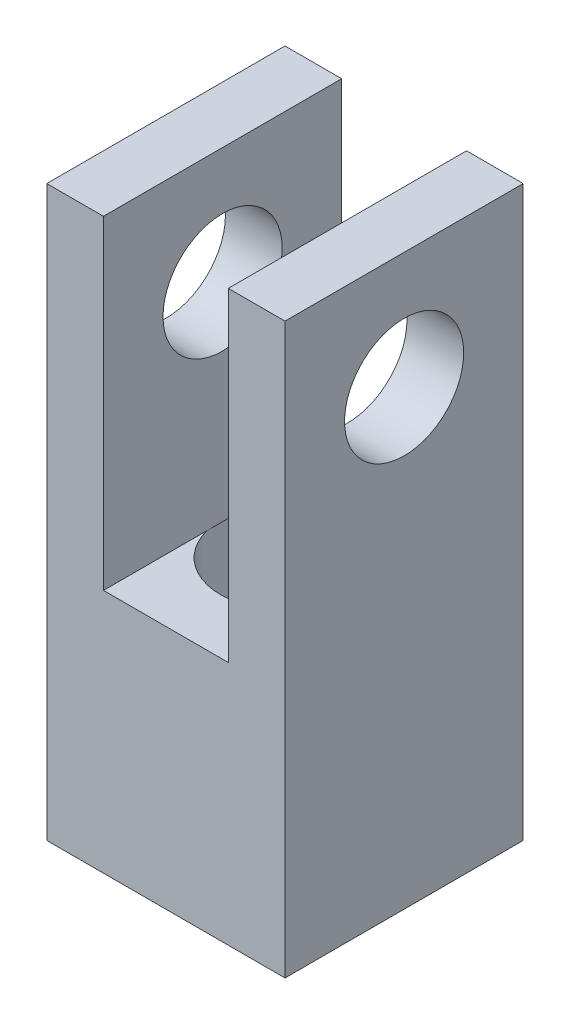
ISO-10303-21;
HEADER;
FILE_DESCRIPTION(('STEP AP214'),'2;1');
FILE_NAME('part.step','',(''),(''),'','','');
FILE_SCHEMA(('AUTOMOTIVE_DESIGN { 1 0 10303 214 1 1 1 1 }'));
ENDSEC;
DATA;
#1=APPLICATION_CONTEXT('core data for automotive mechanical design processes');
#2=APPLICATION_PROTOCOL_DEFINITION('international standard','automotive_design',2000,#1);
#3=PRODUCT_CONTEXT('',#1,'mechanical');
#4=PRODUCT('Part','Part','',(#3));
#5=PRODUCT_RELATED_PRODUCT_CATEGORY('part','',(#4));
#6=PRODUCT_DEFINITION_FORMATION('','',#4);
#7=PRODUCT_DEFINITION_CONTEXT('part definition',#1,'design');
#8=PRODUCT_DEFINITION('design','',#6,#7);
#9=PRODUCT_DEFINITION_SHAPE('','',#8);
#10=(LENGTH_UNIT() NAMED_UNIT(*) SI_UNIT(.MILLI.,.METRE.));
#11=(NAMED_UNIT(*) PLANE_ANGLE_UNIT() SI_UNIT($,.RADIAN.));
#12=(NAMED_UNIT(*) SI_UNIT($,.STERADIAN.) SOLID_ANGLE_UNIT());
#13=UNCERTAINTY_MEASURE_WITH_UNIT(LENGTH_MEASURE(1.E-05),#10,'distance_accuracy_value','');
#14=(GEOMETRIC_REPRESENTATION_CONTEXT(3) GLOBAL_UNCERTAINTY_ASSIGNED_CONTEXT((#13)) GLOBAL_UNIT_ASSIGNED_CONTEXT((#10,
#11,#12)) REPRESENTATION_CONTEXT('',''));
#15=CARTESIAN_POINT('',(0.,0.,0.));
#16=DIRECTION('',(0.,0.,1.));
#17=DIRECTION('',(1.,0.,0.));
#18=AXIS2_PLACEMENT_3D('',#15,#16,#17);
#19=CARTESIAN_POINT('',(0.,13.0556,0.));
#20=DIRECTION('',(0.,-1.,0.));
#21=DIRECTION('',(0.,0.,-1.));
#22=AXIS2_PLACEMENT_3D('',#19,#20,#21);
#23=PLANE('',#22);
#24=DIRECTION('',(0.,0.,-1.));
#25=VECTOR('',#24,1.);
#26=CARTESIAN_POINT('',(3.3274,13.0556,6.35));
#27=LINE('',#26,#25);
#28=CARTESIAN_POINT('',(3.3274,13.0556,6.35));
#29=VERTEX_POINT('',#28);
#30=CARTESIAN_POINT('',(3.3274,13.0556,0.828522926659245));
#31=VERTEX_POINT('',#30);
#32=EDGE_CURVE('E147',#29,#31,#27,.T.);
#33=ORIENTED_EDGE('',*,*,#32,.T.);
#34=CARTESIAN_POINT('',(0.,13.0556,0.));
#35=DIRECTION('',(0.,-1.,0.));
#36=DIRECTION('',(0.,0.,-1.));
#37=AXIS2_PLACEMENT_3D('',#34,#35,#36);
#38=CIRCLE('',#37,3.429);
#39=CARTESIAN_POINT('',(-3.3274,13.0556,0.828522926659248));
#40=VERTEX_POINT('',#39);
#41=EDGE_CURVE('E11',#31,#40,#38,.T.);
#42=ORIENTED_EDGE('',*,*,#41,.T.);
#43=DIRECTION('',(0.,0.,1.));
#44=VECTOR('',#43,1.);
#45=CARTESIAN_POINT('',(-3.3274,13.0556,6.35));
#46=LINE('',#45,#44);
#47=CARTESIAN_POINT('',(-3.3274,13.0556,6.35));
#48=VERTEX_POINT('',#47);
#49=EDGE_CURVE('E136',#40,#48,#46,.T.);
#50=ORIENTED_EDGE('',*,*,#49,.T.);
#51=DIRECTION('',(1.,0.,0.));
#52=VECTOR('',#51,1.);
#53=CARTESIAN_POINT('',(-3.3274,13.0556,6.35));
#54=LINE('',#53,#52);
#55=EDGE_CURVE('E141',#48,#29,#54,.T.);
#56=ORIENTED_EDGE('',*,*,#55,.T.);
#57=EDGE_LOOP('',(#33,#42,#50,#56));
#58=FACE_BOUND('',#57,.T.);
#59=ADVANCED_FACE('F41',(#58),#23,.F.);
#60=CARTESIAN_POINT('',(0.,30.3276,0.));
#61=DIRECTION('',(0.,-1.,0.));
#62=DIRECTION('',(0.,0.,-1.));
#63=AXIS2_PLACEMENT_3D('',#60,#61,#62);
#64=PLANE('',#63);
#65=DIRECTION('',(-1.,0.,0.));
#66=VECTOR('',#65,1.);
#67=CARTESIAN_POINT('',(-6.35,30.3276,-6.35));
#68=LINE('',#67,#66);
#69=CARTESIAN_POINT('',(6.35,30.3276,-6.35));
#70=VERTEX_POINT('',#69);
#71=CARTESIAN_POINT('',(3.3274,30.3276,-6.35));
#72=VERTEX_POINT('',#71);
#73=EDGE_CURVE('E265',#70,#72,#68,.T.);
#74=ORIENTED_EDGE('',*,*,#73,.T.);
#75=DIRECTION('',(0.,0.,-1.));
#76=VECTOR('',#75,1.);
#77=CARTESIAN_POINT('',(3.3274,30.3276,6.35));
#78=LINE('',#77,#76);
#79=CARTESIAN_POINT('',(3.3274,30.3276,6.35));
#80=VERTEX_POINT('',#79);
#81=EDGE_CURVE('E156',#80,#72,#78,.T.);
#82=ORIENTED_EDGE('',*,*,#81,.F.);
#83=DIRECTION('',(1.,0.,0.));
#84=VECTOR('',#83,1.);
#85=CARTESIAN_POINT('',(-6.35,30.3276,6.35));
#86=LINE('',#85,#84);
#87=CARTESIAN_POINT('',(6.35,30.3276,6.35));
#88=VERTEX_POINT('',#87);
#89=EDGE_CURVE('E267',#80,#88,#86,.T.);
#90=ORIENTED_EDGE('',*,*,#89,.T.);
#91=DIRECTION('',(0.,0.,-1.));
#92=VECTOR('',#91,1.);
#93=CARTESIAN_POINT('',(6.35,30.3276,6.35));
#94=LINE('',#93,#92);
#95=EDGE_CURVE('E196',#88,#70,#94,.T.);
#96=ORIENTED_EDGE('',*,*,#95,.T.);
#97=EDGE_LOOP('',(#74,#82,#90,#96));
#98=FACE_BOUND('',#97,.T.);
#99=ADVANCED_FACE('F224',(#98),#64,.F.);
#100=CARTESIAN_POINT('',(6.35,30.3276,6.35));
#101=DIRECTION('',(-1.,0.,0.));
#102=DIRECTION('',(0.,0.,1.));
#103=AXIS2_PLACEMENT_3D('',#100,#101,#102);
#104=PLANE('',#103);
#105=CARTESIAN_POINT('',(6.35,24.1046,0.));
#106=DIRECTION('',(1.,0.,0.));
#107=DIRECTION('',(0.,0.,-1.));
#108=AXIS2_PLACEMENT_3D('',#105,#106,#107);
#109=CIRCLE('',#108,3.175);
#110=CARTESIAN_POINT('',(6.35,24.1046,-3.175));
#111=VERTEX_POINT('',#110);
#112=EDGE_CURVE('E129',#111,#111,#109,.T.);
#113=ORIENTED_EDGE('',*,*,#112,.F.);
#114=EDGE_LOOP('',(#113));
#115=FACE_BOUND('',#114,.T.);
#116=DIRECTION('',(0.,0.,-1.));
#117=VECTOR('',#116,1.);
#118=CARTESIAN_POINT('',(6.35,0.,6.35));
#119=LINE('',#118,#117);
#120=CARTESIAN_POINT('',(6.35,0.,6.35));
#121=VERTEX_POINT('',#120);
#122=CARTESIAN_POINT('',(6.35,0.,-6.35));
#123=VERTEX_POINT('',#122);
#124=EDGE_CURVE('E176',#121,#123,#119,.T.);
#125=ORIENTED_EDGE('',*,*,#124,.T.);
#126=DIRECTION('',(0.,-1.,0.));
#127=VECTOR('',#126,1.);
#128=CARTESIAN_POINT('',(6.35,30.3276,-6.35));
#129=LINE('',#128,#127);
#130=EDGE_CURVE('E124',#70,#123,#129,.T.);
#131=ORIENTED_EDGE('',*,*,#130,.F.);
#132=ORIENTED_EDGE('',*,*,#95,.F.);
#133=DIRECTION('',(0.,-1.,0.));
#134=VECTOR('',#133,1.);
#135=CARTESIAN_POINT('',(6.35,30.3276,6.35));
#136=LINE('',#135,#134);
#137=EDGE_CURVE('E197',#88,#121,#136,.T.);
#138=ORIENTED_EDGE('',*,*,#137,.T.);
#139=EDGE_LOOP('',(#125,#131,#132,#138));
#140=FACE_BOUND('',#139,.T.);
#141=ADVANCED_FACE('F43',(#115,#140),#104,.F.);
#142=CARTESIAN_POINT('',(-6.35,30.3276,-6.35));
#143=DIRECTION('',(0.,0.,1.));
#144=DIRECTION('',(1.,0.,0.));
#145=AXIS2_PLACEMENT_3D('',#142,#143,#144);
#146=PLANE('',#145);
#147=DIRECTION('',(-1.,0.,0.));
#148=VECTOR('',#147,1.);
#149=CARTESIAN_POINT('',(-3.3274,13.0556,-6.35));
#150=LINE('',#149,#148);
#151=CARTESIAN_POINT('',(3.3274,13.0556,-6.35));
#152=VERTEX_POINT('',#151);
#153=CARTESIAN_POINT('',(-3.3274,13.0556,-6.35));
#154=VERTEX_POINT('',#153);
#155=EDGE_CURVE('E140',#152,#154,#150,.T.);
#156=ORIENTED_EDGE('',*,*,#155,.F.);
#157=DIRECTION('',(0.,1.,0.));
#158=VECTOR('',#157,1.);
#159=CARTESIAN_POINT('',(3.3274,13.0556,-6.35));
#160=LINE('',#159,#158);
#161=EDGE_CURVE('E143',#152,#72,#160,.T.);
#162=ORIENTED_EDGE('',*,*,#161,.T.);
#163=ORIENTED_EDGE('',*,*,#73,.F.);
#164=ORIENTED_EDGE('',*,*,#130,.T.);
#165=DIRECTION('',(-1.,0.,0.));
#166=VECTOR('',#165,1.);
#167=CARTESIAN_POINT('',(-6.35,0.,-6.35));
#168=LINE('',#167,#166);
#169=CARTESIAN_POINT('',(-6.35,0.,-6.35));
#170=VERTEX_POINT('',#169);
#171=EDGE_CURVE('E179',#123,#170,#168,.T.);
#172=ORIENTED_EDGE('',*,*,#171,.T.);
#173=DIRECTION('',(0.,-1.,0.));
#174=VECTOR('',#173,1.);
#175=CARTESIAN_POINT('',(-6.35,30.3276,-6.35));
#176=LINE('',#175,#174);
#177=CARTESIAN_POINT('',(-6.35,30.3276,-6.35));
#178=VERTEX_POINT('',#177);
#179=EDGE_CURVE('E202',#178,#170,#176,.T.);
#180=ORIENTED_EDGE('',*,*,#179,.F.);
#181=CARTESIAN_POINT('',(-3.3274,30.3276,-6.35));
#182=VERTEX_POINT('',#181);
#183=EDGE_CURVE('E257',#182,#178,#68,.T.);
#184=ORIENTED_EDGE('',*,*,#183,.F.);
#185=DIRECTION('',(0.,1.,0.));
#186=VECTOR('',#185,1.);
#187=CARTESIAN_POINT('',(-3.3274,13.0556,-6.35));
#188=LINE('',#187,#186);
#189=EDGE_CURVE('E64',#154,#182,#188,.T.);
#190=ORIENTED_EDGE('',*,*,#189,.F.);
#191=EDGE_LOOP('',(#156,#162,#163,#164,#172,#180,#184,#190));
#192=FACE_BOUND('',#191,.T.);
#193=ADVANCED_FACE('F244',(#192),#146,.F.);
#194=CARTESIAN_POINT('',(-6.35,30.3276,6.35));
#195=DIRECTION('',(1.,0.,0.));
#196=DIRECTION('',(0.,0.,-1.));
#197=AXIS2_PLACEMENT_3D('',#194,#195,#196);
#198=PLANE('',#197);
#199=CARTESIAN_POINT('',(-6.35,24.1046,0.));
#200=DIRECTION('',(1.,0.,0.));
#201=DIRECTION('',(0.,0.,-1.));
#202=AXIS2_PLACEMENT_3D('',#199,#200,#201);
#203=CIRCLE('',#202,3.175);
#204=CARTESIAN_POINT('',(-6.35,24.1046,-3.175));
#205=VERTEX_POINT('',#204);
#206=EDGE_CURVE('E160',#205,#205,#203,.T.);
#207=ORIENTED_EDGE('',*,*,#206,.T.);
#208=EDGE_LOOP('',(#207));
#209=FACE_BOUND('',#208,.T.);
#210=DIRECTION('',(0.,0.,1.));
#211=VECTOR('',#210,1.);
#212=CARTESIAN_POINT('',(-6.35,0.,6.35));
#213=LINE('',#212,#211);
#214=CARTESIAN_POINT('',(-6.35,0.,6.35));
#215=VERTEX_POINT('',#214);
#216=EDGE_CURVE('E186',#170,#215,#213,.T.);
#217=ORIENTED_EDGE('',*,*,#216,.T.);
#218=DIRECTION('',(0.,-1.,0.));
#219=VECTOR('',#218,1.);
#220=CARTESIAN_POINT('',(-6.35,30.3276,6.35));
#221=LINE('',#220,#219);
#222=CARTESIAN_POINT('',(-6.35,30.3276,6.35));
#223=VERTEX_POINT('',#222);
#224=EDGE_CURVE('E199',#223,#215,#221,.T.);
#225=ORIENTED_EDGE('',*,*,#224,.F.);
#226=DIRECTION('',(0.,0.,1.));
#227=VECTOR('',#226,1.);
#228=CARTESIAN_POINT('',(-6.35,30.3276,6.35));
#229=LINE('',#228,#227);
#230=EDGE_CURVE('E266',#178,#223,#229,.T.);
#231=ORIENTED_EDGE('',*,*,#230,.F.);
#232=ORIENTED_EDGE('',*,*,#179,.T.);
#233=EDGE_LOOP('',(#217,#225,#231,#232));
#234=FACE_BOUND('',#233,.T.);
#235=ADVANCED_FACE('F241',(#209,#234),#198,.F.);
#236=CARTESIAN_POINT('',(-6.35,30.3276,6.35));
#237=DIRECTION('',(0.,0.,-1.));
#238=DIRECTION('',(-1.,0.,0.));
#239=AXIS2_PLACEMENT_3D('',#236,#237,#238);
#240=PLANE('',#239);
#241=ORIENTED_EDGE('',*,*,#89,.F.);
#242=DIRECTION('',(0.,1.,0.));
#243=VECTOR('',#242,1.);
#244=CARTESIAN_POINT('',(3.3274,13.0556,6.35));
#245=LINE('',#244,#243);
#246=EDGE_CURVE('E184',#29,#80,#245,.T.);
#247=ORIENTED_EDGE('',*,*,#246,.F.);
#248=ORIENTED_EDGE('',*,*,#55,.F.);
#249=DIRECTION('',(0.,1.,0.));
#250=VECTOR('',#249,1.);
#251=CARTESIAN_POINT('',(-3.3274,13.0556,6.35));
#252=LINE('',#251,#250);
#253=CARTESIAN_POINT('',(-3.3274,30.3276,6.35));
#254=VERTEX_POINT('',#253);
#255=EDGE_CURVE('E188',#48,#254,#252,.T.);
#256=ORIENTED_EDGE('',*,*,#255,.T.);
#257=EDGE_CURVE('E191',#223,#254,#86,.T.);
#258=ORIENTED_EDGE('',*,*,#257,.F.);
#259=ORIENTED_EDGE('',*,*,#224,.T.);
#260=DIRECTION('',(1.,0.,0.));
#261=VECTOR('',#260,1.);
#262=CARTESIAN_POINT('',(-6.35,0.,6.35));
#263=LINE('',#262,#261);
#264=EDGE_CURVE('E178',#215,#121,#263,.T.);
#265=ORIENTED_EDGE('',*,*,#264,.T.);
#266=ORIENTED_EDGE('',*,*,#137,.F.);
#267=EDGE_LOOP('',(#241,#247,#248,#256,#258,#259,#265,#266));
#268=FACE_BOUND('',#267,.T.);
#269=ADVANCED_FACE('F236',(#268),#240,.F.);
#270=ORIENTED_EDGE('',*,*,#257,.T.);
#271=DIRECTION('',(0.,0.,1.));
#272=VECTOR('',#271,1.);
#273=CARTESIAN_POINT('',(-3.3274,30.3276,6.35));
#274=LINE('',#273,#272);
#275=EDGE_CURVE('E275',#182,#254,#274,.T.);
#276=ORIENTED_EDGE('',*,*,#275,.F.);
#277=ORIENTED_EDGE('',*,*,#183,.T.);
#278=ORIENTED_EDGE('',*,*,#230,.T.);
#279=EDGE_LOOP('',(#270,#276,#277,#278));
#280=FACE_BOUND('',#279,.T.);
#281=ADVANCED_FACE('F171',(#280),#64,.F.);
#282=CARTESIAN_POINT('',(0.,0.,0.));
#283=DIRECTION('',(0.,-1.,0.));
#284=DIRECTION('',(0.,0.,-1.));
#285=AXIS2_PLACEMENT_3D('',#282,#283,#284);
#286=PLANE('',#285);
#287=CARTESIAN_POINT('',(0.,0.,0.));
#288=DIRECTION('',(0.,-1.,0.));
#289=DIRECTION('',(0.,0.,-1.));
#290=AXIS2_PLACEMENT_3D('',#287,#288,#289);
#291=CIRCLE('',#290,3.429);
#292=CARTESIAN_POINT('',(0.,0.,-3.429));
#293=VERTEX_POINT('',#292);
#294=EDGE_CURVE('E163',#293,#293,#291,.T.);
#295=ORIENTED_EDGE('',*,*,#294,.F.);
#296=EDGE_LOOP('',(#295));
#297=FACE_BOUND('',#296,.T.);
#298=ORIENTED_EDGE('',*,*,#124,.F.);
#299=ORIENTED_EDGE('',*,*,#264,.F.);
#300=ORIENTED_EDGE('',*,*,#216,.F.);
#301=ORIENTED_EDGE('',*,*,#171,.F.);
#302=EDGE_LOOP('',(#298,#299,#300,#301));
#303=FACE_BOUND('',#302,.T.);
#304=ADVANCED_FACE('F167',(#297,#303),#286,.T.);
#305=CARTESIAN_POINT('',(3.3274,13.0556,6.35));
#306=DIRECTION('',(1.,0.,0.));
#307=DIRECTION('',(0.,0.,-1.));
#308=AXIS2_PLACEMENT_3D('',#305,#306,#307);
#309=PLANE('',#308);
#310=CARTESIAN_POINT('',(3.3274,24.1046,0.));
#311=DIRECTION('',(1.,0.,0.));
#312=DIRECTION('',(0.,0.,-1.));
#313=AXIS2_PLACEMENT_3D('',#310,#311,#312);
#314=CIRCLE('',#313,3.175);
#315=CARTESIAN_POINT('',(3.3274,24.1046,-3.175));
#316=VERTEX_POINT('',#315);
#317=EDGE_CURVE('E153',#316,#316,#314,.T.);
#318=ORIENTED_EDGE('',*,*,#317,.T.);
#319=EDGE_LOOP('',(#318));
#320=FACE_BOUND('',#319,.T.);
#321=ORIENTED_EDGE('',*,*,#81,.T.);
#322=ORIENTED_EDGE('',*,*,#161,.F.);
#323=CARTESIAN_POINT('',(3.3274,13.0556,-0.828522926659245));
#324=VERTEX_POINT('',#323);
#325=EDGE_CURVE('E151',#324,#152,#27,.T.);
#326=ORIENTED_EDGE('',*,*,#325,.F.);
#327=EDGE_CURVE('E149',#31,#324,#27,.T.);
#328=ORIENTED_EDGE('',*,*,#327,.F.);
#329=ORIENTED_EDGE('',*,*,#32,.F.);
#330=ORIENTED_EDGE('',*,*,#246,.T.);
#331=EDGE_LOOP('',(#321,#322,#326,#328,#329,#330));
#332=FACE_BOUND('',#331,.T.);
#333=ADVANCED_FACE('F170',(#320,#332),#309,.F.);
#334=CARTESIAN_POINT('',(-3.3274,13.0556,6.35));
#335=DIRECTION('',(-1.,0.,0.));
#336=DIRECTION('',(0.,0.,1.));
#337=AXIS2_PLACEMENT_3D('',#334,#335,#336);
#338=PLANE('',#337);
#339=CARTESIAN_POINT('',(-3.3274,24.1046,0.));
#340=DIRECTION('',(-1.,0.,0.));
#341=DIRECTION('',(0.,0.,1.));
#342=AXIS2_PLACEMENT_3D('',#339,#340,#341);
#343=CIRCLE('',#342,3.175);
#344=CARTESIAN_POINT('',(-3.3274,24.1046,3.175));
#345=VERTEX_POINT('',#344);
#346=EDGE_CURVE('E157',#345,#345,#343,.T.);
#347=ORIENTED_EDGE('',*,*,#346,.T.);
#348=EDGE_LOOP('',(#347));
#349=FACE_BOUND('',#348,.T.);
#350=ORIENTED_EDGE('',*,*,#275,.T.);
#351=ORIENTED_EDGE('',*,*,#255,.F.);
#352=ORIENTED_EDGE('',*,*,#49,.F.);
#353=CARTESIAN_POINT('',(-3.3274,13.0556,-0.828522926659248));
#354=VERTEX_POINT('',#353);
#355=EDGE_CURVE('E128',#354,#40,#46,.T.);
#356=ORIENTED_EDGE('',*,*,#355,.F.);
#357=EDGE_CURVE('E133',#154,#354,#46,.T.);
#358=ORIENTED_EDGE('',*,*,#357,.F.);
#359=ORIENTED_EDGE('',*,*,#189,.T.);
#360=EDGE_LOOP('',(#350,#351,#352,#356,#358,#359));
#361=FACE_BOUND('',#360,.T.);
#362=ADVANCED_FACE('F132',(#349,#361),#338,.F.);
#363=ORIENTED_EDGE('',*,*,#357,.T.);
#364=EDGE_CURVE('E45',#354,#324,#38,.T.);
#365=ORIENTED_EDGE('',*,*,#364,.T.);
#366=ORIENTED_EDGE('',*,*,#325,.T.);
#367=ORIENTED_EDGE('',*,*,#155,.T.);
#368=EDGE_LOOP('',(#363,#365,#366,#367));
#369=FACE_BOUND('',#368,.T.);
#370=ADVANCED_FACE('F138',(#369),#23,.F.);
#371=CARTESIAN_POINT('',(-6.35,24.1046,0.));
#372=DIRECTION('',(1.,0.,0.));
#373=DIRECTION('',(0.,0.,-1.));
#374=AXIS2_PLACEMENT_3D('',#371,#372,#373);
#375=CYLINDRICAL_SURFACE('',#374,3.175);
#376=ORIENTED_EDGE('',*,*,#206,.F.);
#377=EDGE_LOOP('',(#376));
#378=FACE_BOUND('',#377,.T.);
#379=ORIENTED_EDGE('',*,*,#346,.F.);
#380=EDGE_LOOP('',(#379));
#381=FACE_BOUND('',#380,.T.);
#382=ADVANCED_FACE('F209',(#378,#381),#375,.F.);
#383=ORIENTED_EDGE('',*,*,#112,.T.);
#384=EDGE_LOOP('',(#383));
#385=FACE_BOUND('',#384,.T.);
#386=ORIENTED_EDGE('',*,*,#317,.F.);
#387=EDGE_LOOP('',(#386));
#388=FACE_BOUND('',#387,.T.);
#389=ADVANCED_FACE('F211',(#385,#388),#375,.F.);
#390=CARTESIAN_POINT('',(0.,13.0556,0.));
#391=DIRECTION('',(0.,-1.,0.));
#392=DIRECTION('',(0.,0.,-1.));
#393=AXIS2_PLACEMENT_3D('',#390,#391,#392);
#394=PLANE('',#393);
#395=ORIENTED_EDGE('',*,*,#327,.T.);
#396=CARTESIAN_POINT('',(0.,13.0556,0.));
#397=DIRECTION('',(0.,-1.,0.));
#398=DIRECTION('',(0.,0.,-1.));
#399=AXIS2_PLACEMENT_3D('',#396,#397,#398);
#400=CIRCLE('',#399,3.429);
#401=EDGE_CURVE('E56',#31,#324,#400,.F.);
#402=ORIENTED_EDGE('',*,*,#401,.F.);
#403=EDGE_LOOP('',(#395,#402));
#404=FACE_BOUND('',#403,.T.);
#405=ADVANCED_FACE('F218',(#404),#394,.T.);
#406=ORIENTED_EDGE('',*,*,#355,.T.);
#407=EDGE_CURVE('E120',#354,#40,#400,.F.);
#408=ORIENTED_EDGE('',*,*,#407,.F.);
#409=EDGE_LOOP('',(#406,#408));
#410=FACE_BOUND('',#409,.T.);
#411=ADVANCED_FACE('F127',(#410),#394,.T.);
#412=CARTESIAN_POINT('',(0.,22.7542766107547,0.));
#413=DIRECTION('',(0.,-1.,0.));
#414=DIRECTION('',(0.,0.,-1.));
#415=AXIS2_PLACEMENT_3D('',#412,#413,#414);
#416=CYLINDRICAL_SURFACE('',#415,3.429);
#417=ORIENTED_EDGE('',*,*,#407,.T.);
#418=ORIENTED_EDGE('',*,*,#41,.F.);
#419=ORIENTED_EDGE('',*,*,#401,.T.);
#420=ORIENTED_EDGE('',*,*,#364,.F.);
#421=EDGE_LOOP('',(#417,#418,#419,#420));
#422=FACE_BOUND('',#421,.T.);
#423=ORIENTED_EDGE('',*,*,#294,.T.);
#424=EDGE_LOOP('',(#423));
#425=FACE_BOUND('',#424,.T.);
#426=ADVANCED_FACE('F118',(#422,#425),#416,.F.);
#427=CLOSED_SHELL('',(#59,#99,#141,#193,#235,#269,#281,#304,#333,#362,#370,#382,#389,#405,#411,#426));
#428=MANIFOLD_SOLID_BREP('B2',#427);
#429=ADVANCED_BREP_SHAPE_REPRESENTATION('',(#18,#428),#14);
#430=SHAPE_DEFINITION_REPRESENTATION(#9,#429);
ENDSEC;
END-ISO-10303-21;
